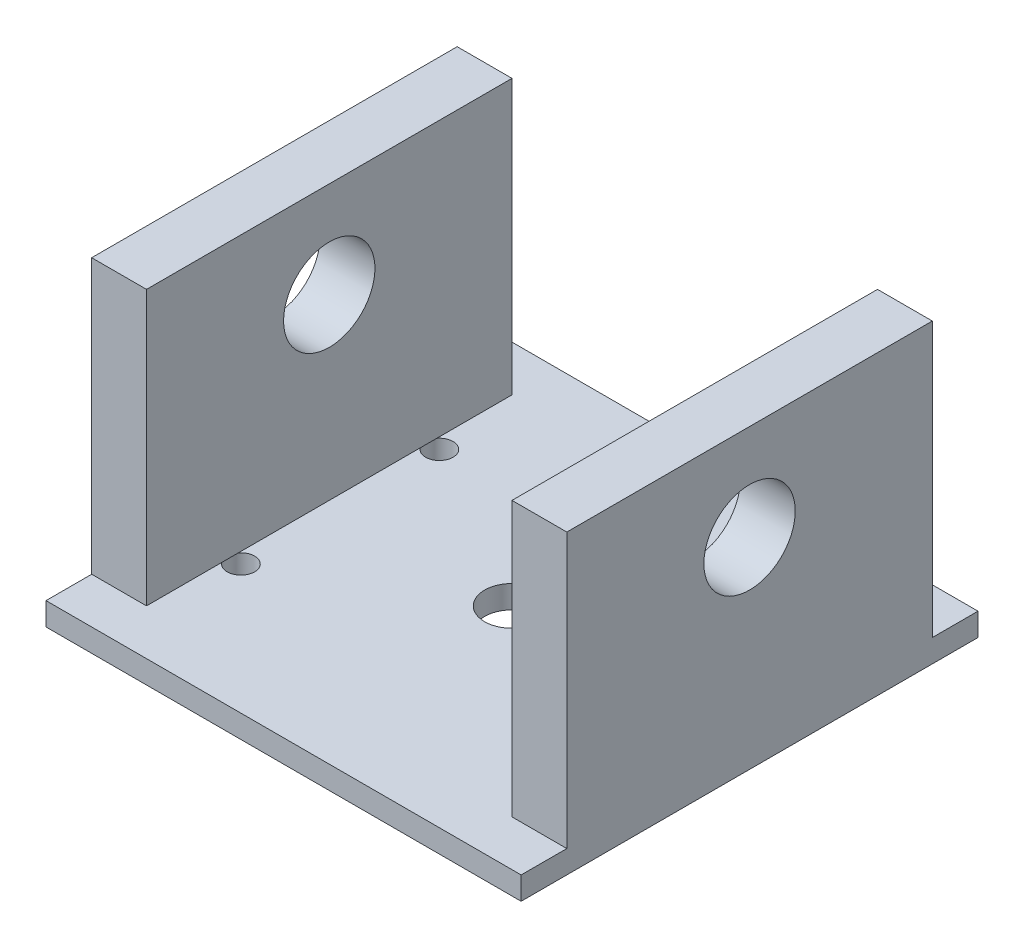
ISO-10303-21;
HEADER;
FILE_DESCRIPTION(('STEP AP214'),'2;1');
FILE_NAME('part.step','',(''),(''),'','','');
FILE_SCHEMA(('AUTOMOTIVE_DESIGN { 1 0 10303 214 1 1 1 1 }'));
ENDSEC;
DATA;
#1=APPLICATION_CONTEXT('core data for automotive mechanical design processes');
#2=APPLICATION_PROTOCOL_DEFINITION('international standard','automotive_design',2000,#1);
#3=PRODUCT_CONTEXT('',#1,'mechanical');
#4=PRODUCT('Part','Part','',(#3));
#5=PRODUCT_RELATED_PRODUCT_CATEGORY('part','',(#4));
#6=PRODUCT_DEFINITION_FORMATION('','',#4);
#7=PRODUCT_DEFINITION_CONTEXT('part definition',#1,'design');
#8=PRODUCT_DEFINITION('design','',#6,#7);
#9=PRODUCT_DEFINITION_SHAPE('','',#8);
#10=(LENGTH_UNIT() NAMED_UNIT(*) SI_UNIT(.MILLI.,.METRE.));
#11=(NAMED_UNIT(*) PLANE_ANGLE_UNIT() SI_UNIT($,.RADIAN.));
#12=(NAMED_UNIT(*) SI_UNIT($,.STERADIAN.) SOLID_ANGLE_UNIT());
#13=UNCERTAINTY_MEASURE_WITH_UNIT(LENGTH_MEASURE(1.E-05),#10,'distance_accuracy_value','');
#14=(GEOMETRIC_REPRESENTATION_CONTEXT(3) GLOBAL_UNCERTAINTY_ASSIGNED_CONTEXT((#13)) GLOBAL_UNIT_ASSIGNED_CONTEXT((#10,
#11,#12)) REPRESENTATION_CONTEXT('',''));
#15=CARTESIAN_POINT('',(0.,0.,0.));
#16=DIRECTION('',(0.,0.,1.));
#17=DIRECTION('',(1.,0.,0.));
#18=AXIS2_PLACEMENT_3D('',#15,#16,#17);
#19=CARTESIAN_POINT('',(0.,5.,0.));
#20=DIRECTION('',(0.,-1.,0.));
#21=DIRECTION('',(0.,0.,-1.));
#22=AXIS2_PLACEMENT_3D('',#19,#20,#21);
#23=PLANE('',#22);
#24=CARTESIAN_POINT('',(0.,5.,0.));
#25=DIRECTION('',(0.,1.,0.));
#26=DIRECTION('',(0.,0.,1.));
#27=AXIS2_PLACEMENT_3D('',#24,#25,#26);
#28=CIRCLE('',#27,6.);
#29=CARTESIAN_POINT('',(0.,5.,6.));
#30=VERTEX_POINT('',#29);
#31=EDGE_CURVE('E214',#30,#30,#28,.T.);
#32=ORIENTED_EDGE('',*,*,#31,.F.);
#33=EDGE_LOOP('',(#32));
#34=FACE_BOUND('',#33,.T.);
#35=DIRECTION('',(1.,0.,0.));
#36=VECTOR('',#35,1.);
#37=CARTESIAN_POINT('',(-52.,5.,40.));
#38=LINE('',#37,#36);
#39=CARTESIAN_POINT('',(-52.,5.,40.));
#40=VERTEX_POINT('',#39);
#41=CARTESIAN_POINT('',(-40.,5.,40.));
#42=VERTEX_POINT('',#41);
#43=EDGE_CURVE('E323',#40,#42,#38,.T.);
#44=ORIENTED_EDGE('',*,*,#43,.F.);
#45=DIRECTION('',(0.,0.,1.));
#46=VECTOR('',#45,1.);
#47=CARTESIAN_POINT('',(-52.,5.,-50.));
#48=LINE('',#47,#46);
#49=CARTESIAN_POINT('',(-52.,5.,50.));
#50=VERTEX_POINT('',#49);
#51=EDGE_CURVE('E180',#40,#50,#48,.T.);
#52=ORIENTED_EDGE('',*,*,#51,.T.);
#53=DIRECTION('',(1.,0.,0.));
#54=VECTOR('',#53,1.);
#55=CARTESIAN_POINT('',(52.,5.,50.));
#56=LINE('',#55,#54);
#57=CARTESIAN_POINT('',(52.,5.,50.));
#58=VERTEX_POINT('',#57);
#59=EDGE_CURVE('E251',#50,#58,#56,.T.);
#60=ORIENTED_EDGE('',*,*,#59,.T.);
#61=DIRECTION('',(0.,0.,-1.));
#62=VECTOR('',#61,1.);
#63=CARTESIAN_POINT('',(52.,5.,-50.));
#64=LINE('',#63,#62);
#65=CARTESIAN_POINT('',(52.,5.,40.));
#66=VERTEX_POINT('',#65);
#67=EDGE_CURVE('E254',#58,#66,#64,.T.);
#68=ORIENTED_EDGE('',*,*,#67,.T.);
#69=DIRECTION('',(1.,0.,0.));
#70=VECTOR('',#69,1.);
#71=CARTESIAN_POINT('',(52.,5.,40.));
#72=LINE('',#71,#70);
#73=CARTESIAN_POINT('',(40.,5.,40.));
#74=VERTEX_POINT('',#73);
#75=EDGE_CURVE('E194',#74,#66,#72,.T.);
#76=ORIENTED_EDGE('',*,*,#75,.F.);
#77=DIRECTION('',(0.,0.,1.));
#78=VECTOR('',#77,1.);
#79=CARTESIAN_POINT('',(40.,5.,-40.));
#80=LINE('',#79,#78);
#81=CARTESIAN_POINT('',(40.,5.,23.5463625050904));
#82=VERTEX_POINT('',#81);
#83=EDGE_CURVE('E47',#82,#74,#80,.T.);
#84=ORIENTED_EDGE('',*,*,#83,.F.);
#85=CARTESIAN_POINT('',(37.62,5.,21.72));
#86=DIRECTION('',(0.,1.,0.));
#87=DIRECTION('',(0.,0.,-1.));
#88=AXIS2_PLACEMENT_3D('',#85,#86,#87);
#89=CIRCLE('',#88,3.);
#90=CARTESIAN_POINT('',(40.,5.,19.8936374949096));
#91=VERTEX_POINT('',#90);
#92=EDGE_CURVE('E238',#91,#82,#89,.T.);
#93=ORIENTED_EDGE('',*,*,#92,.F.);
#94=CARTESIAN_POINT('',(40.,5.,-19.8936374949096));
#95=VERTEX_POINT('',#94);
#96=EDGE_CURVE('E11',#95,#91,#80,.T.);
#97=ORIENTED_EDGE('',*,*,#96,.F.);
#98=CARTESIAN_POINT('',(37.62,5.,-21.72));
#99=DIRECTION('',(0.,1.,0.));
#100=DIRECTION('',(0.,0.,1.));
#101=AXIS2_PLACEMENT_3D('',#98,#99,#100);
#102=CIRCLE('',#101,3.);
#103=CARTESIAN_POINT('',(40.,5.,-23.5463625050904));
#104=VERTEX_POINT('',#103);
#105=EDGE_CURVE('E231',#104,#95,#102,.T.);
#106=ORIENTED_EDGE('',*,*,#105,.F.);
#107=CARTESIAN_POINT('',(40.,5.,-40.));
#108=VERTEX_POINT('',#107);
#109=EDGE_CURVE('E64',#108,#104,#80,.T.);
#110=ORIENTED_EDGE('',*,*,#109,.F.);
#111=DIRECTION('',(-1.,0.,0.));
#112=VECTOR('',#111,1.);
#113=CARTESIAN_POINT('',(52.,5.,-40.));
#114=LINE('',#113,#112);
#115=CARTESIAN_POINT('',(52.,5.,-40.));
#116=VERTEX_POINT('',#115);
#117=EDGE_CURVE('E181',#116,#108,#114,.T.);
#118=ORIENTED_EDGE('',*,*,#117,.F.);
#119=CARTESIAN_POINT('',(52.,5.,-50.));
#120=VERTEX_POINT('',#119);
#121=EDGE_CURVE('E253',#116,#120,#64,.T.);
#122=ORIENTED_EDGE('',*,*,#121,.T.);
#123=DIRECTION('',(-1.,0.,0.));
#124=VECTOR('',#123,1.);
#125=CARTESIAN_POINT('',(52.,5.,-50.));
#126=LINE('',#125,#124);
#127=CARTESIAN_POINT('',(-52.,5.,-50.));
#128=VERTEX_POINT('',#127);
#129=EDGE_CURVE('E256',#120,#128,#126,.T.);
#130=ORIENTED_EDGE('',*,*,#129,.T.);
#131=CARTESIAN_POINT('',(-52.,5.,-40.));
#132=VERTEX_POINT('',#131);
#133=EDGE_CURVE('E248',#128,#132,#48,.T.);
#134=ORIENTED_EDGE('',*,*,#133,.T.);
#135=DIRECTION('',(-1.,0.,0.));
#136=VECTOR('',#135,1.);
#137=CARTESIAN_POINT('',(-52.,5.,-40.));
#138=LINE('',#137,#136);
#139=CARTESIAN_POINT('',(-40.,5.,-40.));
#140=VERTEX_POINT('',#139);
#141=EDGE_CURVE('E175',#140,#132,#138,.T.);
#142=ORIENTED_EDGE('',*,*,#141,.F.);
#143=DIRECTION('',(0.,0.,-1.));
#144=VECTOR('',#143,1.);
#145=CARTESIAN_POINT('',(-40.,5.,-40.));
#146=LINE('',#145,#144);
#147=CARTESIAN_POINT('',(-40.,5.,-23.5463625050904));
#148=VERTEX_POINT('',#147);
#149=EDGE_CURVE('E322',#148,#140,#146,.T.);
#150=ORIENTED_EDGE('',*,*,#149,.F.);
#151=CARTESIAN_POINT('',(-37.62,5.,-21.72));
#152=DIRECTION('',(0.,1.,0.));
#153=DIRECTION('',(0.,0.,-1.));
#154=AXIS2_PLACEMENT_3D('',#151,#152,#153);
#155=CIRCLE('',#154,3.);
#156=CARTESIAN_POINT('',(-40.,5.,-19.8936374949096));
#157=VERTEX_POINT('',#156);
#158=EDGE_CURVE('E224',#157,#148,#155,.T.);
#159=ORIENTED_EDGE('',*,*,#158,.F.);
#160=CARTESIAN_POINT('',(-40.,5.,19.8936374949096));
#161=VERTEX_POINT('',#160);
#162=EDGE_CURVE('E56',#161,#157,#146,.T.);
#163=ORIENTED_EDGE('',*,*,#162,.F.);
#164=CARTESIAN_POINT('',(-37.62,5.,21.72));
#165=DIRECTION('',(0.,1.,0.));
#166=DIRECTION('',(0.,0.,1.));
#167=AXIS2_PLACEMENT_3D('',#164,#165,#166);
#168=CIRCLE('',#167,3.);
#169=CARTESIAN_POINT('',(-40.,5.,23.5463625050904));
#170=VERTEX_POINT('',#169);
#171=EDGE_CURVE('E245',#170,#161,#168,.T.);
#172=ORIENTED_EDGE('',*,*,#171,.F.);
#173=EDGE_CURVE('E318',#42,#170,#146,.T.);
#174=ORIENTED_EDGE('',*,*,#173,.F.);
#175=EDGE_LOOP('',(#44,#52,#60,#68,#76,#84,#93,#97,#106,#110,#118,#122,#130,#134,#142,#150,#159,
#163,#172,#174));
#176=FACE_BOUND('',#175,.T.);
#177=ADVANCED_FACE('F38',(#34,#176),#23,.F.);
#178=CARTESIAN_POINT('',(0.,0.,0.));
#179=DIRECTION('',(0.,-1.,0.));
#180=DIRECTION('',(0.,0.,-1.));
#181=AXIS2_PLACEMENT_3D('',#178,#179,#180);
#182=PLANE('',#181);
#183=CARTESIAN_POINT('',(-37.62,0.,-21.72));
#184=DIRECTION('',(0.,1.,0.));
#185=DIRECTION('',(0.,0.,-1.));
#186=AXIS2_PLACEMENT_3D('',#183,#184,#185);
#187=CIRCLE('',#186,3.);
#188=CARTESIAN_POINT('',(-37.62,0.,-24.72));
#189=VERTEX_POINT('',#188);
#190=EDGE_CURVE('E217',#189,#189,#187,.T.);
#191=ORIENTED_EDGE('',*,*,#190,.T.);
#192=EDGE_LOOP('',(#191));
#193=FACE_BOUND('',#192,.T.);
#194=CARTESIAN_POINT('',(37.62,0.,21.72));
#195=DIRECTION('',(0.,1.,0.));
#196=DIRECTION('',(0.,0.,-1.));
#197=AXIS2_PLACEMENT_3D('',#194,#195,#196);
#198=CIRCLE('',#197,3.);
#199=CARTESIAN_POINT('',(37.62,0.,18.72));
#200=VERTEX_POINT('',#199);
#201=EDGE_CURVE('E230',#200,#200,#198,.T.);
#202=ORIENTED_EDGE('',*,*,#201,.T.);
#203=EDGE_LOOP('',(#202));
#204=FACE_BOUND('',#203,.T.);
#205=DIRECTION('',(0.,0.,1.));
#206=VECTOR('',#205,1.);
#207=CARTESIAN_POINT('',(-52.,0.,-50.));
#208=LINE('',#207,#206);
#209=CARTESIAN_POINT('',(-52.,0.,-50.));
#210=VERTEX_POINT('',#209);
#211=CARTESIAN_POINT('',(-52.,0.,50.));
#212=VERTEX_POINT('',#211);
#213=EDGE_CURVE('E244',#210,#212,#208,.T.);
#214=ORIENTED_EDGE('',*,*,#213,.F.);
#215=DIRECTION('',(-1.,0.,0.));
#216=VECTOR('',#215,1.);
#217=CARTESIAN_POINT('',(52.,0.,-50.));
#218=LINE('',#217,#216);
#219=CARTESIAN_POINT('',(52.,0.,-50.));
#220=VERTEX_POINT('',#219);
#221=EDGE_CURVE('E264',#220,#210,#218,.T.);
#222=ORIENTED_EDGE('',*,*,#221,.F.);
#223=DIRECTION('',(0.,0.,-1.));
#224=VECTOR('',#223,1.);
#225=CARTESIAN_POINT('',(52.,0.,-50.));
#226=LINE('',#225,#224);
#227=CARTESIAN_POINT('',(52.,0.,50.));
#228=VERTEX_POINT('',#227);
#229=EDGE_CURVE('E262',#228,#220,#226,.T.);
#230=ORIENTED_EDGE('',*,*,#229,.F.);
#231=DIRECTION('',(1.,0.,0.));
#232=VECTOR('',#231,1.);
#233=CARTESIAN_POINT('',(52.,0.,50.));
#234=LINE('',#233,#232);
#235=EDGE_CURVE('E260',#212,#228,#234,.T.);
#236=ORIENTED_EDGE('',*,*,#235,.F.);
#237=EDGE_LOOP('',(#214,#222,#230,#236));
#238=FACE_BOUND('',#237,.T.);
#239=CARTESIAN_POINT('',(-37.62,0.,21.72));
#240=DIRECTION('',(0.,1.,0.));
#241=DIRECTION('',(0.,0.,1.));
#242=AXIS2_PLACEMENT_3D('',#239,#240,#241);
#243=CIRCLE('',#242,3.);
#244=CARTESIAN_POINT('',(-37.62,0.,24.72));
#245=VERTEX_POINT('',#244);
#246=EDGE_CURVE('E237',#245,#245,#243,.T.);
#247=ORIENTED_EDGE('',*,*,#246,.T.);
#248=EDGE_LOOP('',(#247));
#249=FACE_BOUND('',#248,.T.);
#250=CARTESIAN_POINT('',(37.62,0.,-21.72));
#251=DIRECTION('',(0.,1.,0.));
#252=DIRECTION('',(0.,0.,1.));
#253=AXIS2_PLACEMENT_3D('',#250,#251,#252);
#254=CIRCLE('',#253,3.);
#255=CARTESIAN_POINT('',(37.62,0.,-18.72));
#256=VERTEX_POINT('',#255);
#257=EDGE_CURVE('E223',#256,#256,#254,.T.);
#258=ORIENTED_EDGE('',*,*,#257,.T.);
#259=EDGE_LOOP('',(#258));
#260=FACE_BOUND('',#259,.T.);
#261=CARTESIAN_POINT('',(0.,0.,0.));
#262=DIRECTION('',(0.,1.,0.));
#263=DIRECTION('',(0.,0.,1.));
#264=AXIS2_PLACEMENT_3D('',#261,#262,#263);
#265=CIRCLE('',#264,6.);
#266=CARTESIAN_POINT('',(0.,0.,6.));
#267=VERTEX_POINT('',#266);
#268=EDGE_CURVE('E213',#267,#267,#265,.T.);
#269=ORIENTED_EDGE('',*,*,#268,.T.);
#270=EDGE_LOOP('',(#269));
#271=FACE_BOUND('',#270,.T.);
#272=ADVANCED_FACE('F350',(#193,#204,#238,#249,#260,#271),#182,.T.);
#273=CARTESIAN_POINT('',(-52.,5.,-50.));
#274=DIRECTION('',(1.,0.,0.));
#275=DIRECTION('',(0.,0.,-1.));
#276=AXIS2_PLACEMENT_3D('',#273,#274,#275);
#277=PLANE('',#276);
#278=CARTESIAN_POINT('',(-52.,44.,0.));
#279=DIRECTION('',(1.,0.,0.));
#280=DIRECTION('',(0.,0.,-1.));
#281=AXIS2_PLACEMENT_3D('',#278,#279,#280);
#282=CIRCLE('',#281,10.);
#283=CARTESIAN_POINT('',(-52.,44.,10.));
#284=VERTEX_POINT('',#283);
#285=EDGE_CURVE('E324',#284,#284,#282,.T.);
#286=ORIENTED_EDGE('',*,*,#285,.T.);
#287=EDGE_LOOP('',(#286));
#288=FACE_BOUND('',#287,.T.);
#289=ORIENTED_EDGE('',*,*,#213,.T.);
#290=DIRECTION('',(0.,-1.,0.));
#291=VECTOR('',#290,1.);
#292=CARTESIAN_POINT('',(-52.,5.,50.));
#293=LINE('',#292,#291);
#294=EDGE_CURVE('E273',#50,#212,#293,.T.);
#295=ORIENTED_EDGE('',*,*,#294,.F.);
#296=ORIENTED_EDGE('',*,*,#51,.F.);
#297=DIRECTION('',(0.,-1.,0.));
#298=VECTOR('',#297,1.);
#299=CARTESIAN_POINT('',(-52.,65.,40.));
#300=LINE('',#299,#298);
#301=CARTESIAN_POINT('',(-52.,65.,40.));
#302=VERTEX_POINT('',#301);
#303=EDGE_CURVE('E159',#302,#40,#300,.T.);
#304=ORIENTED_EDGE('',*,*,#303,.F.);
#305=DIRECTION('',(0.,0.,1.));
#306=VECTOR('',#305,1.);
#307=CARTESIAN_POINT('',(-52.,65.,-40.));
#308=LINE('',#307,#306);
#309=CARTESIAN_POINT('',(-52.,65.,-40.));
#310=VERTEX_POINT('',#309);
#311=EDGE_CURVE('E166',#310,#302,#308,.T.);
#312=ORIENTED_EDGE('',*,*,#311,.F.);
#313=DIRECTION('',(0.,-1.,0.));
#314=VECTOR('',#313,1.);
#315=CARTESIAN_POINT('',(-52.,65.,-40.));
#316=LINE('',#315,#314);
#317=EDGE_CURVE('E311',#310,#132,#316,.T.);
#318=ORIENTED_EDGE('',*,*,#317,.T.);
#319=ORIENTED_EDGE('',*,*,#133,.F.);
#320=DIRECTION('',(0.,-1.,0.));
#321=VECTOR('',#320,1.);
#322=CARTESIAN_POINT('',(-52.,5.,-50.));
#323=LINE('',#322,#321);
#324=EDGE_CURVE('E258',#128,#210,#323,.T.);
#325=ORIENTED_EDGE('',*,*,#324,.T.);
#326=EDGE_LOOP('',(#289,#295,#296,#304,#312,#318,#319,#325));
#327=FACE_BOUND('',#326,.T.);
#328=ADVANCED_FACE('F40',(#288,#327),#277,.F.);
#329=CARTESIAN_POINT('',(52.,5.,50.));
#330=DIRECTION('',(0.,0.,-1.));
#331=DIRECTION('',(-1.,0.,0.));
#332=AXIS2_PLACEMENT_3D('',#329,#330,#331);
#333=PLANE('',#332);
#334=ORIENTED_EDGE('',*,*,#235,.T.);
#335=DIRECTION('',(0.,-1.,0.));
#336=VECTOR('',#335,1.);
#337=CARTESIAN_POINT('',(52.,5.,50.));
#338=LINE('',#337,#336);
#339=EDGE_CURVE('E271',#58,#228,#338,.T.);
#340=ORIENTED_EDGE('',*,*,#339,.F.);
#341=ORIENTED_EDGE('',*,*,#59,.F.);
#342=ORIENTED_EDGE('',*,*,#294,.T.);
#343=EDGE_LOOP('',(#334,#340,#341,#342));
#344=FACE_BOUND('',#343,.T.);
#345=ADVANCED_FACE('F349',(#344),#333,.F.);
#346=CARTESIAN_POINT('',(52.,5.,-50.));
#347=DIRECTION('',(-1.,0.,0.));
#348=DIRECTION('',(0.,0.,1.));
#349=AXIS2_PLACEMENT_3D('',#346,#347,#348);
#350=PLANE('',#349);
#351=CARTESIAN_POINT('',(52.,44.,0.));
#352=DIRECTION('',(-1.,0.,0.));
#353=DIRECTION('',(0.,0.,1.));
#354=AXIS2_PLACEMENT_3D('',#351,#352,#353);
#355=CIRCLE('',#354,10.);
#356=CARTESIAN_POINT('',(52.,44.,10.));
#357=VERTEX_POINT('',#356);
#358=EDGE_CURVE('E332',#357,#357,#355,.T.);
#359=ORIENTED_EDGE('',*,*,#358,.T.);
#360=EDGE_LOOP('',(#359));
#361=FACE_BOUND('',#360,.T.);
#362=ORIENTED_EDGE('',*,*,#229,.T.);
#363=DIRECTION('',(0.,-1.,0.));
#364=VECTOR('',#363,1.);
#365=CARTESIAN_POINT('',(52.,5.,-50.));
#366=LINE('',#365,#364);
#367=EDGE_CURVE('E268',#120,#220,#366,.T.);
#368=ORIENTED_EDGE('',*,*,#367,.F.);
#369=ORIENTED_EDGE('',*,*,#121,.F.);
#370=DIRECTION('',(0.,-1.,0.));
#371=VECTOR('',#370,1.);
#372=CARTESIAN_POINT('',(52.,65.,-40.));
#373=LINE('',#372,#371);
#374=CARTESIAN_POINT('',(52.,65.,-40.));
#375=VERTEX_POINT('',#374);
#376=EDGE_CURVE('E199',#375,#116,#373,.T.);
#377=ORIENTED_EDGE('',*,*,#376,.F.);
#378=DIRECTION('',(0.,0.,-1.));
#379=VECTOR('',#378,1.);
#380=CARTESIAN_POINT('',(52.,65.,-40.));
#381=LINE('',#380,#379);
#382=CARTESIAN_POINT('',(52.,65.,40.));
#383=VERTEX_POINT('',#382);
#384=EDGE_CURVE('E198',#383,#375,#381,.T.);
#385=ORIENTED_EDGE('',*,*,#384,.F.);
#386=DIRECTION('',(0.,-1.,0.));
#387=VECTOR('',#386,1.);
#388=CARTESIAN_POINT('',(52.,65.,40.));
#389=LINE('',#388,#387);
#390=EDGE_CURVE('E205',#383,#66,#389,.T.);
#391=ORIENTED_EDGE('',*,*,#390,.T.);
#392=ORIENTED_EDGE('',*,*,#67,.F.);
#393=ORIENTED_EDGE('',*,*,#339,.T.);
#394=EDGE_LOOP('',(#362,#368,#369,#377,#385,#391,#392,#393));
#395=FACE_BOUND('',#394,.T.);
#396=ADVANCED_FACE('F300',(#361,#395),#350,.F.);
#397=CARTESIAN_POINT('',(52.,5.,-50.));
#398=DIRECTION('',(0.,0.,1.));
#399=DIRECTION('',(1.,0.,0.));
#400=AXIS2_PLACEMENT_3D('',#397,#398,#399);
#401=PLANE('',#400);
#402=ORIENTED_EDGE('',*,*,#221,.T.);
#403=ORIENTED_EDGE('',*,*,#324,.F.);
#404=ORIENTED_EDGE('',*,*,#129,.F.);
#405=ORIENTED_EDGE('',*,*,#367,.T.);
#406=EDGE_LOOP('',(#402,#403,#404,#405));
#407=FACE_BOUND('',#406,.T.);
#408=ADVANCED_FACE('F306',(#407),#401,.F.);
#409=CARTESIAN_POINT('',(-37.62,5.,21.72));
#410=DIRECTION('',(0.,-1.,0.));
#411=DIRECTION('',(0.,0.,-1.));
#412=AXIS2_PLACEMENT_3D('',#409,#410,#411);
#413=CYLINDRICAL_SURFACE('',#412,3.);
#414=EDGE_CURVE('E241',#161,#170,#168,.T.);
#415=ORIENTED_EDGE('',*,*,#414,.T.);
#416=ORIENTED_EDGE('',*,*,#171,.T.);
#417=EDGE_LOOP('',(#415,#416));
#418=FACE_BOUND('',#417,.T.);
#419=ORIENTED_EDGE('',*,*,#246,.F.);
#420=EDGE_LOOP('',(#419));
#421=FACE_BOUND('',#420,.T.);
#422=ADVANCED_FACE('F364',(#418,#421),#413,.F.);
#423=CARTESIAN_POINT('',(37.62,5.,21.72));
#424=DIRECTION('',(0.,-1.,0.));
#425=DIRECTION('',(0.,0.,-1.));
#426=AXIS2_PLACEMENT_3D('',#423,#424,#425);
#427=CYLINDRICAL_SURFACE('',#426,3.);
#428=EDGE_CURVE('E234',#82,#91,#89,.T.);
#429=ORIENTED_EDGE('',*,*,#428,.T.);
#430=ORIENTED_EDGE('',*,*,#92,.T.);
#431=EDGE_LOOP('',(#429,#430));
#432=FACE_BOUND('',#431,.T.);
#433=ORIENTED_EDGE('',*,*,#201,.F.);
#434=EDGE_LOOP('',(#433));
#435=FACE_BOUND('',#434,.T.);
#436=ADVANCED_FACE('F386',(#432,#435),#427,.F.);
#437=CARTESIAN_POINT('',(37.62,5.,-21.72));
#438=DIRECTION('',(0.,-1.,0.));
#439=DIRECTION('',(0.,0.,-1.));
#440=AXIS2_PLACEMENT_3D('',#437,#438,#439);
#441=CYLINDRICAL_SURFACE('',#440,3.);
#442=EDGE_CURVE('E227',#95,#104,#102,.T.);
#443=ORIENTED_EDGE('',*,*,#442,.T.);
#444=ORIENTED_EDGE('',*,*,#105,.T.);
#445=EDGE_LOOP('',(#443,#444));
#446=FACE_BOUND('',#445,.T.);
#447=ORIENTED_EDGE('',*,*,#257,.F.);
#448=EDGE_LOOP('',(#447));
#449=FACE_BOUND('',#448,.T.);
#450=ADVANCED_FACE('F393',(#446,#449),#441,.F.);
#451=CARTESIAN_POINT('',(-37.62,5.,-21.72));
#452=DIRECTION('',(0.,-1.,0.));
#453=DIRECTION('',(0.,0.,-1.));
#454=AXIS2_PLACEMENT_3D('',#451,#452,#453);
#455=CYLINDRICAL_SURFACE('',#454,3.);
#456=EDGE_CURVE('E220',#148,#157,#155,.T.);
#457=ORIENTED_EDGE('',*,*,#456,.T.);
#458=ORIENTED_EDGE('',*,*,#158,.T.);
#459=EDGE_LOOP('',(#457,#458));
#460=FACE_BOUND('',#459,.T.);
#461=ORIENTED_EDGE('',*,*,#190,.F.);
#462=EDGE_LOOP('',(#461));
#463=FACE_BOUND('',#462,.T.);
#464=ADVANCED_FACE('F400',(#460,#463),#455,.F.);
#465=CARTESIAN_POINT('',(0.,5.,0.));
#466=DIRECTION('',(0.,-1.,0.));
#467=DIRECTION('',(0.,0.,-1.));
#468=AXIS2_PLACEMENT_3D('',#465,#466,#467);
#469=CYLINDRICAL_SURFACE('',#468,6.);
#470=ORIENTED_EDGE('',*,*,#31,.T.);
#471=EDGE_LOOP('',(#470));
#472=FACE_BOUND('',#471,.T.);
#473=ORIENTED_EDGE('',*,*,#268,.F.);
#474=EDGE_LOOP('',(#473));
#475=FACE_BOUND('',#474,.T.);
#476=ADVANCED_FACE('F408',(#472,#475),#469,.F.);
#477=CARTESIAN_POINT('',(0.,5.,0.));
#478=DIRECTION('',(0.,1.,0.));
#479=DIRECTION('',(0.,0.,1.));
#480=AXIS2_PLACEMENT_3D('',#477,#478,#479);
#481=PLANE('',#480);
#482=ORIENTED_EDGE('',*,*,#428,.F.);
#483=EDGE_CURVE('E184',#91,#82,#80,.T.);
#484=ORIENTED_EDGE('',*,*,#483,.F.);
#485=EDGE_LOOP('',(#482,#484));
#486=FACE_BOUND('',#485,.T.);
#487=ADVANCED_FACE('F416',(#486),#481,.F.);
#488=CARTESIAN_POINT('',(52.,65.,-40.));
#489=DIRECTION('',(0.,0.,1.));
#490=DIRECTION('',(1.,0.,0.));
#491=AXIS2_PLACEMENT_3D('',#488,#489,#490);
#492=PLANE('',#491);
#493=ORIENTED_EDGE('',*,*,#117,.T.);
#494=DIRECTION('',(0.,-1.,0.));
#495=VECTOR('',#494,1.);
#496=CARTESIAN_POINT('',(40.,65.,-40.));
#497=LINE('',#496,#495);
#498=CARTESIAN_POINT('',(40.,65.,-40.));
#499=VERTEX_POINT('',#498);
#500=EDGE_CURVE('E211',#499,#108,#497,.T.);
#501=ORIENTED_EDGE('',*,*,#500,.F.);
#502=DIRECTION('',(-1.,0.,0.));
#503=VECTOR('',#502,1.);
#504=CARTESIAN_POINT('',(52.,65.,-40.));
#505=LINE('',#504,#503);
#506=EDGE_CURVE('E190',#375,#499,#505,.T.);
#507=ORIENTED_EDGE('',*,*,#506,.F.);
#508=ORIENTED_EDGE('',*,*,#376,.T.);
#509=EDGE_LOOP('',(#493,#501,#507,#508));
#510=FACE_BOUND('',#509,.T.);
#511=ADVANCED_FACE('F296',(#510),#492,.F.);
#512=CARTESIAN_POINT('',(40.,65.,-40.));
#513=DIRECTION('',(1.,0.,0.));
#514=DIRECTION('',(0.,0.,-1.));
#515=AXIS2_PLACEMENT_3D('',#512,#513,#514);
#516=PLANE('',#515);
#517=CARTESIAN_POINT('',(40.,44.,0.));
#518=DIRECTION('',(1.,0.,0.));
#519=DIRECTION('',(0.,0.,-1.));
#520=AXIS2_PLACEMENT_3D('',#517,#518,#519);
#521=CIRCLE('',#520,10.);
#522=CARTESIAN_POINT('',(40.,44.,10.));
#523=VERTEX_POINT('',#522);
#524=EDGE_CURVE('E329',#523,#523,#521,.T.);
#525=ORIENTED_EDGE('',*,*,#524,.T.);
#526=EDGE_LOOP('',(#525));
#527=FACE_BOUND('',#526,.T.);
#528=ORIENTED_EDGE('',*,*,#109,.T.);
#529=EDGE_CURVE('E49',#104,#95,#80,.T.);
#530=ORIENTED_EDGE('',*,*,#529,.T.);
#531=ORIENTED_EDGE('',*,*,#96,.T.);
#532=ORIENTED_EDGE('',*,*,#483,.T.);
#533=ORIENTED_EDGE('',*,*,#83,.T.);
#534=DIRECTION('',(0.,-1.,0.));
#535=VECTOR('',#534,1.);
#536=CARTESIAN_POINT('',(40.,65.,40.));
#537=LINE('',#536,#535);
#538=CARTESIAN_POINT('',(40.,65.,40.));
#539=VERTEX_POINT('',#538);
#540=EDGE_CURVE('E208',#539,#74,#537,.T.);
#541=ORIENTED_EDGE('',*,*,#540,.F.);
#542=DIRECTION('',(0.,0.,1.));
#543=VECTOR('',#542,1.);
#544=CARTESIAN_POINT('',(40.,65.,-40.));
#545=LINE('',#544,#543);
#546=EDGE_CURVE('E193',#499,#539,#545,.T.);
#547=ORIENTED_EDGE('',*,*,#546,.F.);
#548=ORIENTED_EDGE('',*,*,#500,.T.);
#549=EDGE_LOOP('',(#528,#530,#531,#532,#533,#541,#547,#548));
#550=FACE_BOUND('',#549,.T.);
#551=ADVANCED_FACE('F281',(#527,#550),#516,.F.);
#552=CARTESIAN_POINT('',(52.,65.,40.));
#553=DIRECTION('',(0.,0.,-1.));
#554=DIRECTION('',(-1.,0.,0.));
#555=AXIS2_PLACEMENT_3D('',#552,#553,#554);
#556=PLANE('',#555);
#557=ORIENTED_EDGE('',*,*,#75,.T.);
#558=ORIENTED_EDGE('',*,*,#390,.F.);
#559=DIRECTION('',(1.,0.,0.));
#560=VECTOR('',#559,1.);
#561=CARTESIAN_POINT('',(52.,65.,40.));
#562=LINE('',#561,#560);
#563=EDGE_CURVE('E196',#539,#383,#562,.T.);
#564=ORIENTED_EDGE('',*,*,#563,.F.);
#565=ORIENTED_EDGE('',*,*,#540,.T.);
#566=EDGE_LOOP('',(#557,#558,#564,#565));
#567=FACE_BOUND('',#566,.T.);
#568=ADVANCED_FACE('F286',(#567),#556,.F.);
#569=CARTESIAN_POINT('',(0.,65.,0.));
#570=DIRECTION('',(0.,1.,0.));
#571=DIRECTION('',(0.,0.,1.));
#572=AXIS2_PLACEMENT_3D('',#569,#570,#571);
#573=PLANE('',#572);
#574=ORIENTED_EDGE('',*,*,#506,.T.);
#575=ORIENTED_EDGE('',*,*,#546,.T.);
#576=ORIENTED_EDGE('',*,*,#563,.T.);
#577=ORIENTED_EDGE('',*,*,#384,.T.);
#578=EDGE_LOOP('',(#574,#575,#576,#577));
#579=FACE_BOUND('',#578,.T.);
#580=ADVANCED_FACE('F290',(#579),#573,.T.);
#581=ORIENTED_EDGE('',*,*,#442,.F.);
#582=ORIENTED_EDGE('',*,*,#529,.F.);
#583=EDGE_LOOP('',(#581,#582));
#584=FACE_BOUND('',#583,.T.);
#585=ADVANCED_FACE('F425',(#584),#481,.F.);
#586=CARTESIAN_POINT('',(0.,5.,0.));
#587=DIRECTION('',(0.,1.,0.));
#588=DIRECTION('',(0.,0.,1.));
#589=AXIS2_PLACEMENT_3D('',#586,#587,#588);
#590=PLANE('',#589);
#591=ORIENTED_EDGE('',*,*,#414,.F.);
#592=EDGE_CURVE('E321',#170,#161,#146,.T.);
#593=ORIENTED_EDGE('',*,*,#592,.F.);
#594=EDGE_LOOP('',(#591,#593));
#595=FACE_BOUND('',#594,.T.);
#596=ADVANCED_FACE('F456',(#595),#590,.F.);
#597=ORIENTED_EDGE('',*,*,#456,.F.);
#598=EDGE_CURVE('E576',#157,#148,#146,.T.);
#599=ORIENTED_EDGE('',*,*,#598,.F.);
#600=EDGE_LOOP('',(#597,#599));
#601=FACE_BOUND('',#600,.T.);
#602=ADVANCED_FACE('F463',(#601),#590,.F.);
#603=CARTESIAN_POINT('',(-52.,65.,40.));
#604=DIRECTION('',(0.,0.,-1.));
#605=DIRECTION('',(-1.,0.,0.));
#606=AXIS2_PLACEMENT_3D('',#603,#604,#605);
#607=PLANE('',#606);
#608=ORIENTED_EDGE('',*,*,#43,.T.);
#609=DIRECTION('',(0.,-1.,0.));
#610=VECTOR('',#609,1.);
#611=CARTESIAN_POINT('',(-40.,65.,40.));
#612=LINE('',#611,#610);
#613=CARTESIAN_POINT('',(-40.,65.,40.));
#614=VERTEX_POINT('',#613);
#615=EDGE_CURVE('E162',#614,#42,#612,.T.);
#616=ORIENTED_EDGE('',*,*,#615,.F.);
#617=DIRECTION('',(1.,0.,0.));
#618=VECTOR('',#617,1.);
#619=CARTESIAN_POINT('',(-52.,65.,40.));
#620=LINE('',#619,#618);
#621=EDGE_CURVE('E155',#302,#614,#620,.T.);
#622=ORIENTED_EDGE('',*,*,#621,.F.);
#623=ORIENTED_EDGE('',*,*,#303,.T.);
#624=EDGE_LOOP('',(#608,#616,#622,#623));
#625=FACE_BOUND('',#624,.T.);
#626=ADVANCED_FACE('F157',(#625),#607,.F.);
#627=CARTESIAN_POINT('',(-40.,65.,-40.));
#628=DIRECTION('',(-1.,0.,0.));
#629=DIRECTION('',(0.,0.,1.));
#630=AXIS2_PLACEMENT_3D('',#627,#628,#629);
#631=PLANE('',#630);
#632=CARTESIAN_POINT('',(-40.,44.,0.));
#633=DIRECTION('',(-1.,0.,0.));
#634=DIRECTION('',(0.,0.,1.));
#635=AXIS2_PLACEMENT_3D('',#632,#633,#634);
#636=CIRCLE('',#635,10.);
#637=CARTESIAN_POINT('',(-40.,44.,10.));
#638=VERTEX_POINT('',#637);
#639=EDGE_CURVE('E42',#638,#638,#636,.T.);
#640=ORIENTED_EDGE('',*,*,#639,.T.);
#641=EDGE_LOOP('',(#640));
#642=FACE_BOUND('',#641,.T.);
#643=ORIENTED_EDGE('',*,*,#173,.T.);
#644=ORIENTED_EDGE('',*,*,#592,.T.);
#645=ORIENTED_EDGE('',*,*,#162,.T.);
#646=ORIENTED_EDGE('',*,*,#598,.T.);
#647=ORIENTED_EDGE('',*,*,#149,.T.);
#648=DIRECTION('',(0.,-1.,0.));
#649=VECTOR('',#648,1.);
#650=CARTESIAN_POINT('',(-40.,65.,-40.));
#651=LINE('',#650,#649);
#652=CARTESIAN_POINT('',(-40.,65.,-40.));
#653=VERTEX_POINT('',#652);
#654=EDGE_CURVE('E186',#653,#140,#651,.T.);
#655=ORIENTED_EDGE('',*,*,#654,.F.);
#656=DIRECTION('',(0.,0.,-1.));
#657=VECTOR('',#656,1.);
#658=CARTESIAN_POINT('',(-40.,65.,-40.));
#659=LINE('',#658,#657);
#660=EDGE_CURVE('E165',#614,#653,#659,.T.);
#661=ORIENTED_EDGE('',*,*,#660,.F.);
#662=ORIENTED_EDGE('',*,*,#615,.T.);
#663=EDGE_LOOP('',(#643,#644,#645,#646,#647,#655,#661,#662));
#664=FACE_BOUND('',#663,.T.);
#665=ADVANCED_FACE('F339',(#642,#664),#631,.F.);
#666=CARTESIAN_POINT('',(-52.,65.,-40.));
#667=DIRECTION('',(0.,0.,1.));
#668=DIRECTION('',(1.,0.,0.));
#669=AXIS2_PLACEMENT_3D('',#666,#667,#668);
#670=PLANE('',#669);
#671=ORIENTED_EDGE('',*,*,#141,.T.);
#672=ORIENTED_EDGE('',*,*,#317,.F.);
#673=DIRECTION('',(-1.,0.,0.));
#674=VECTOR('',#673,1.);
#675=CARTESIAN_POINT('',(-52.,65.,-40.));
#676=LINE('',#675,#674);
#677=EDGE_CURVE('E171',#653,#310,#676,.T.);
#678=ORIENTED_EDGE('',*,*,#677,.F.);
#679=ORIENTED_EDGE('',*,*,#654,.T.);
#680=EDGE_LOOP('',(#671,#672,#678,#679));
#681=FACE_BOUND('',#680,.T.);
#682=ADVANCED_FACE('F483',(#681),#670,.F.);
#683=CARTESIAN_POINT('',(0.,65.,0.));
#684=DIRECTION('',(0.,1.,0.));
#685=DIRECTION('',(0.,0.,1.));
#686=AXIS2_PLACEMENT_3D('',#683,#684,#685);
#687=PLANE('',#686);
#688=ORIENTED_EDGE('',*,*,#311,.T.);
#689=ORIENTED_EDGE('',*,*,#621,.T.);
#690=ORIENTED_EDGE('',*,*,#660,.T.);
#691=ORIENTED_EDGE('',*,*,#677,.T.);
#692=EDGE_LOOP('',(#688,#689,#690,#691));
#693=FACE_BOUND('',#692,.T.);
#694=ADVANCED_FACE('F169',(#693),#687,.T.);
#695=CARTESIAN_POINT('',(52.,44.,0.));
#696=DIRECTION('',(-1.,0.,0.));
#697=DIRECTION('',(0.,0.,1.));
#698=AXIS2_PLACEMENT_3D('',#695,#696,#697);
#699=CYLINDRICAL_SURFACE('',#698,10.);
#700=CARTESIAN_POINT('',(-40.,44.,10.));
#701=CARTESIAN_POINT('',(-40.125,44.,10.));
#702=CARTESIAN_POINT('',(-40.25,44.,10.));
#703=CARTESIAN_POINT('',(-40.5,44.,10.));
#704=CARTESIAN_POINT('',(-40.625,44.,10.));
#705=CARTESIAN_POINT('',(-40.875,44.,10.));
#706=CARTESIAN_POINT('',(-41.,44.,10.));
#707=CARTESIAN_POINT('',(-41.25,44.,10.));
#708=CARTESIAN_POINT('',(-41.375,44.,10.));
#709=CARTESIAN_POINT('',(-41.625,44.,10.));
#710=CARTESIAN_POINT('',(-41.75,44.,10.));
#711=CARTESIAN_POINT('',(-42.,44.,10.));
#712=CARTESIAN_POINT('',(-42.125,44.,10.));
#713=CARTESIAN_POINT('',(-42.375,44.,10.));
#714=CARTESIAN_POINT('',(-42.5,44.,10.));
#715=CARTESIAN_POINT('',(-42.75,44.,10.));
#716=CARTESIAN_POINT('',(-42.875,44.,10.));
#717=CARTESIAN_POINT('',(-43.125,44.,10.));
#718=CARTESIAN_POINT('',(-43.25,44.,10.));
#719=CARTESIAN_POINT('',(-43.5,44.,10.));
#720=CARTESIAN_POINT('',(-43.625,44.,10.));
#721=CARTESIAN_POINT('',(-43.875,44.,10.));
#722=CARTESIAN_POINT('',(-44.,44.,10.));
#723=CARTESIAN_POINT('',(-44.25,44.,10.));
#724=CARTESIAN_POINT('',(-44.375,44.,10.));
#725=CARTESIAN_POINT('',(-44.625,44.,10.));
#726=CARTESIAN_POINT('',(-44.75,44.,10.));
#727=CARTESIAN_POINT('',(-45.,44.,10.));
#728=CARTESIAN_POINT('',(-45.125,44.,10.));
#729=CARTESIAN_POINT('',(-45.375,44.,10.));
#730=CARTESIAN_POINT('',(-45.5,44.,10.));
#731=CARTESIAN_POINT('',(-45.75,44.,10.));
#732=CARTESIAN_POINT('',(-45.875,44.,10.));
#733=CARTESIAN_POINT('',(-46.125,44.,10.));
#734=CARTESIAN_POINT('',(-46.25,44.,10.));
#735=CARTESIAN_POINT('',(-46.5,44.,10.));
#736=CARTESIAN_POINT('',(-46.625,44.,10.));
#737=CARTESIAN_POINT('',(-46.875,44.,10.));
#738=CARTESIAN_POINT('',(-47.,44.,10.));
#739=CARTESIAN_POINT('',(-47.25,44.,10.));
#740=CARTESIAN_POINT('',(-47.375,44.,10.));
#741=CARTESIAN_POINT('',(-47.625,44.,10.));
#742=CARTESIAN_POINT('',(-47.75,44.,10.));
#743=CARTESIAN_POINT('',(-48.,44.,10.));
#744=CARTESIAN_POINT('',(-48.125,44.,10.));
#745=CARTESIAN_POINT('',(-48.375,44.,10.));
#746=CARTESIAN_POINT('',(-48.5,44.,10.));
#747=CARTESIAN_POINT('',(-48.75,44.,10.));
#748=CARTESIAN_POINT('',(-48.875,44.,10.));
#749=CARTESIAN_POINT('',(-49.125,44.,10.));
#750=CARTESIAN_POINT('',(-49.25,44.,10.));
#751=CARTESIAN_POINT('',(-49.5,44.,10.));
#752=CARTESIAN_POINT('',(-49.625,44.,10.));
#753=CARTESIAN_POINT('',(-49.875,44.,10.));
#754=CARTESIAN_POINT('',(-50.,44.,10.));
#755=CARTESIAN_POINT('',(-50.25,44.,10.));
#756=CARTESIAN_POINT('',(-50.375,44.,10.));
#757=CARTESIAN_POINT('',(-50.625,44.,10.));
#758=CARTESIAN_POINT('',(-50.75,44.,10.));
#759=CARTESIAN_POINT('',(-51.,44.,10.));
#760=CARTESIAN_POINT('',(-51.125,44.,10.));
#761=CARTESIAN_POINT('',(-51.375,44.,10.));
#762=CARTESIAN_POINT('',(-51.5,44.,10.));
#763=CARTESIAN_POINT('',(-51.75,44.,10.));
#764=CARTESIAN_POINT('',(-51.875,44.,10.));
#765=CARTESIAN_POINT('',(-52.,44.,10.));
#766=B_SPLINE_CURVE_WITH_KNOTS('',3,(#700,#701,#702,#703,#704,#705,#706,#707,#708,#709,#710,
#711,#712,#713,#714,#715,#716,#717,#718,#719,#720,#721,#722,#723,#724,#725,#726,#727,#728,#729,
#730,#731,#732,#733,#734,#735,#736,#737,#738,#739,#740,#741,#742,#743,#744,#745,#746,#747,#748,
#749,#750,#751,#752,#753,#754,#755,#756,#757,#758,#759,#760,#761,#762,#763,#764,#765),
.UNSPECIFIED.,.F.,.F.,(4,2,2,2,2,2,2,2,2,2,2,2,2,2,2,2,2,2,2,2,2,2,2,2,2,2,2,2,2,2,2,2,4),(0.,
0.375,0.750000000000001,1.125,1.5,1.875,2.25,2.625,3.,3.37499999999999,3.74999999999999,
4.12499999999999,4.49999999999999,4.87499999999999,5.24999999999999,5.62499999999999,
5.99999999999999,6.37499999999999,6.74999999999999,7.12499999999999,7.49999999999999,
7.87499999999999,8.24999999999999,8.62499999999999,8.99999999999998,9.37499999999999,
9.74999999999998,10.125,10.5,10.875,11.25,11.625,12.),.UNSPECIFIED.);
#767=EDGE_CURVE('BSEAM341',#638,#284,#766,.T.);
#768=ORIENTED_EDGE('',*,*,#639,.F.);
#769=ORIENTED_EDGE('',*,*,#285,.F.);
#770=ORIENTED_EDGE('',*,*,#767,.T.);
#771=ORIENTED_EDGE('',*,*,#767,.F.);
#772=EDGE_LOOP('',(#768,#770,#769,#771));
#773=FACE_BOUND('',#772,.T.);
#774=ADVANCED_FACE('F341',(#773),#699,.F.);
#775=CARTESIAN_POINT('',(52.,44.,10.));
#776=CARTESIAN_POINT('',(51.875,44.,10.));
#777=CARTESIAN_POINT('',(51.75,44.,10.));
#778=CARTESIAN_POINT('',(51.5,44.,10.));
#779=CARTESIAN_POINT('',(51.375,44.,10.));
#780=CARTESIAN_POINT('',(51.125,44.,10.));
#781=CARTESIAN_POINT('',(51.,44.,10.));
#782=CARTESIAN_POINT('',(50.75,44.,10.));
#783=CARTESIAN_POINT('',(50.625,44.,10.));
#784=CARTESIAN_POINT('',(50.375,44.,10.));
#785=CARTESIAN_POINT('',(50.25,44.,10.));
#786=CARTESIAN_POINT('',(50.,44.,10.));
#787=CARTESIAN_POINT('',(49.875,44.,10.));
#788=CARTESIAN_POINT('',(49.625,44.,10.));
#789=CARTESIAN_POINT('',(49.5,44.,10.));
#790=CARTESIAN_POINT('',(49.25,44.,10.));
#791=CARTESIAN_POINT('',(49.125,44.,10.));
#792=CARTESIAN_POINT('',(48.875,44.,10.));
#793=CARTESIAN_POINT('',(48.75,44.,10.));
#794=CARTESIAN_POINT('',(48.5,44.,10.));
#795=CARTESIAN_POINT('',(48.375,44.,10.));
#796=CARTESIAN_POINT('',(48.125,44.,10.));
#797=CARTESIAN_POINT('',(48.,44.,10.));
#798=CARTESIAN_POINT('',(47.75,44.,10.));
#799=CARTESIAN_POINT('',(47.625,44.,10.));
#800=CARTESIAN_POINT('',(47.375,44.,10.));
#801=CARTESIAN_POINT('',(47.25,44.,10.));
#802=CARTESIAN_POINT('',(47.,44.,10.));
#803=CARTESIAN_POINT('',(46.875,44.,10.));
#804=CARTESIAN_POINT('',(46.625,44.,10.));
#805=CARTESIAN_POINT('',(46.5,44.,10.));
#806=CARTESIAN_POINT('',(46.25,44.,10.));
#807=CARTESIAN_POINT('',(46.125,44.,10.));
#808=CARTESIAN_POINT('',(45.875,44.,10.));
#809=CARTESIAN_POINT('',(45.75,44.,10.));
#810=CARTESIAN_POINT('',(45.5,44.,10.));
#811=CARTESIAN_POINT('',(45.375,44.,10.));
#812=CARTESIAN_POINT('',(45.125,44.,10.));
#813=CARTESIAN_POINT('',(45.,44.,10.));
#814=CARTESIAN_POINT('',(44.75,44.,10.));
#815=CARTESIAN_POINT('',(44.625,44.,10.));
#816=CARTESIAN_POINT('',(44.375,44.,10.));
#817=CARTESIAN_POINT('',(44.25,44.,10.));
#818=CARTESIAN_POINT('',(44.,44.,10.));
#819=CARTESIAN_POINT('',(43.875,44.,10.));
#820=CARTESIAN_POINT('',(43.625,44.,10.));
#821=CARTESIAN_POINT('',(43.5,44.,10.));
#822=CARTESIAN_POINT('',(43.25,44.,10.));
#823=CARTESIAN_POINT('',(43.125,44.,10.));
#824=CARTESIAN_POINT('',(42.875,44.,10.));
#825=CARTESIAN_POINT('',(42.75,44.,10.));
#826=CARTESIAN_POINT('',(42.5,44.,10.));
#827=CARTESIAN_POINT('',(42.375,44.,10.));
#828=CARTESIAN_POINT('',(42.125,44.,10.));
#829=CARTESIAN_POINT('',(42.,44.,10.));
#830=CARTESIAN_POINT('',(41.75,44.,10.));
#831=CARTESIAN_POINT('',(41.625,44.,10.));
#832=CARTESIAN_POINT('',(41.375,44.,10.));
#833=CARTESIAN_POINT('',(41.25,44.,10.));
#834=CARTESIAN_POINT('',(41.,44.,10.));
#835=CARTESIAN_POINT('',(40.875,44.,10.));
#836=CARTESIAN_POINT('',(40.625,44.,10.));
#837=CARTESIAN_POINT('',(40.5,44.,10.));
#838=CARTESIAN_POINT('',(40.25,44.,10.));
#839=CARTESIAN_POINT('',(40.125,44.,10.));
#840=CARTESIAN_POINT('',(40.,44.,10.));
#841=B_SPLINE_CURVE_WITH_KNOTS('',3,(#775,#776,#777,#778,#779,#780,#781,#782,#783,#784,#785,
#786,#787,#788,#789,#790,#791,#792,#793,#794,#795,#796,#797,#798,#799,#800,#801,#802,#803,#804,
#805,#806,#807,#808,#809,#810,#811,#812,#813,#814,#815,#816,#817,#818,#819,#820,#821,#822,#823,
#824,#825,#826,#827,#828,#829,#830,#831,#832,#833,#834,#835,#836,#837,#838,#839,#840),
.UNSPECIFIED.,.F.,.F.,(4,2,2,2,2,2,2,2,2,2,2,2,2,2,2,2,2,2,2,2,2,2,2,2,2,2,2,2,2,2,2,2,4),(0.,
0.375,0.750000000000001,1.125,1.5,1.875,2.25,2.625,3.,3.375,3.75,4.125,4.5,4.875,5.25,5.625,6.,
6.375,6.75,7.125,7.5,7.875,8.25,8.625,9.,9.375,9.75,10.125,10.5,10.875,11.25,11.625,12.),.UNSPECIFIED.);
#842=EDGE_CURVE('BSEAM344',#357,#523,#841,.T.);
#843=ORIENTED_EDGE('',*,*,#358,.F.);
#844=ORIENTED_EDGE('',*,*,#524,.F.);
#845=ORIENTED_EDGE('',*,*,#842,.T.);
#846=ORIENTED_EDGE('',*,*,#842,.F.);
#847=EDGE_LOOP('',(#843,#845,#844,#846));
#848=FACE_BOUND('',#847,.T.);
#849=ADVANCED_FACE('F344',(#848),#699,.F.);
#850=CLOSED_SHELL('',(#177,#272,#328,#345,#396,#408,#422,#436,#450,#464,#476,#487,#511,#551,
#568,#580,#585,#596,#602,#626,#665,#682,#694,#774,#849));
#851=MANIFOLD_SOLID_BREP('B2',#850);
#852=ADVANCED_BREP_SHAPE_REPRESENTATION('',(#18,#851),#14);
#853=SHAPE_DEFINITION_REPRESENTATION(#9,#852);
ENDSEC;
END-ISO-10303-21;
